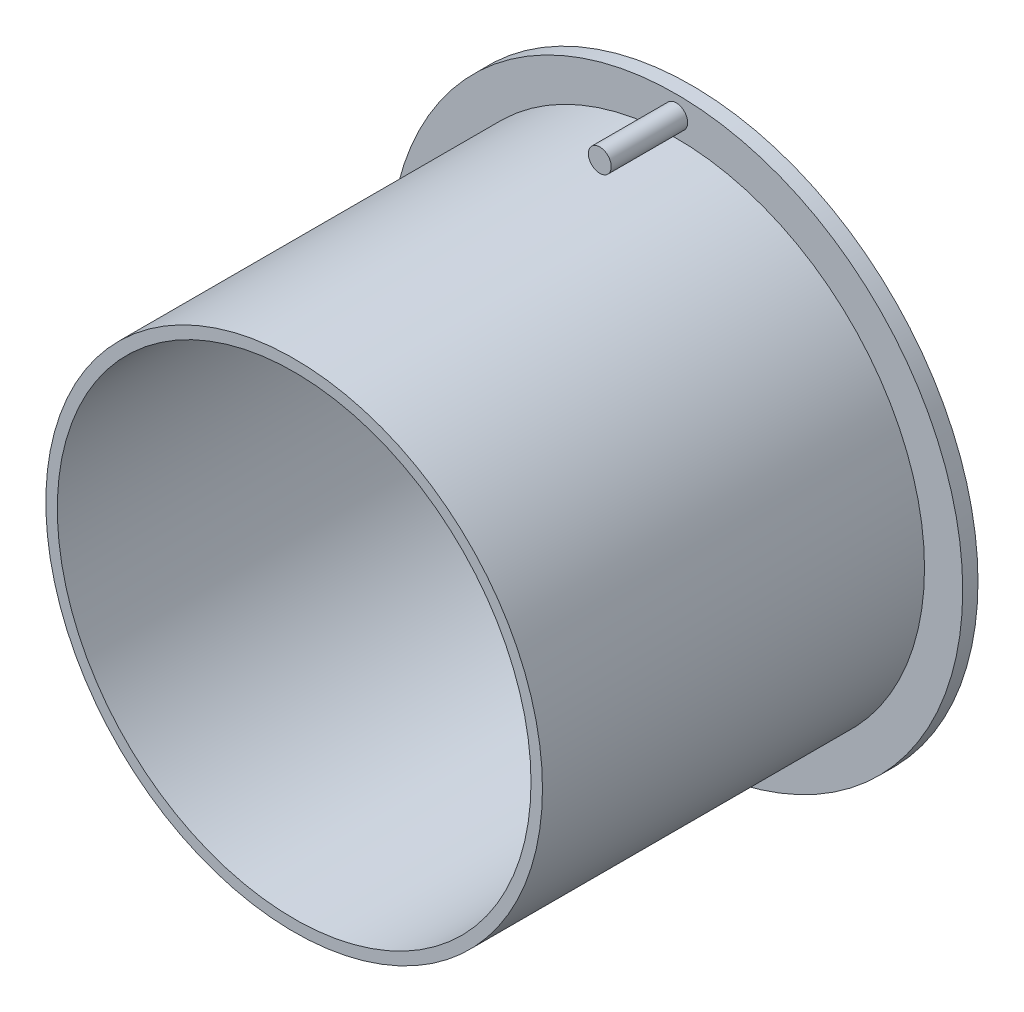
ISO-10303-21;
HEADER;
FILE_DESCRIPTION(('STEP AP214'),'2;1');
FILE_NAME('part.step','',(''),(''),'','','');
FILE_SCHEMA(('AUTOMOTIVE_DESIGN { 1 0 10303 214 1 1 1 1 }'));
ENDSEC;
DATA;
#1=APPLICATION_CONTEXT('core data for automotive mechanical design processes');
#2=APPLICATION_PROTOCOL_DEFINITION('international standard','automotive_design',2000,#1);
#3=PRODUCT_CONTEXT('',#1,'mechanical');
#4=PRODUCT('Part','Part','',(#3));
#5=PRODUCT_RELATED_PRODUCT_CATEGORY('part','',(#4));
#6=PRODUCT_DEFINITION_FORMATION('','',#4);
#7=PRODUCT_DEFINITION_CONTEXT('part definition',#1,'design');
#8=PRODUCT_DEFINITION('design','',#6,#7);
#9=PRODUCT_DEFINITION_SHAPE('','',#8);
#10=(LENGTH_UNIT() NAMED_UNIT(*) SI_UNIT(.MILLI.,.METRE.));
#11=(NAMED_UNIT(*) PLANE_ANGLE_UNIT() SI_UNIT($,.RADIAN.));
#12=(NAMED_UNIT(*) SI_UNIT($,.STERADIAN.) SOLID_ANGLE_UNIT());
#13=UNCERTAINTY_MEASURE_WITH_UNIT(LENGTH_MEASURE(1.E-05),#10,'distance_accuracy_value','');
#14=(GEOMETRIC_REPRESENTATION_CONTEXT(3) GLOBAL_UNCERTAINTY_ASSIGNED_CONTEXT((#13)) GLOBAL_UNIT_ASSIGNED_CONTEXT((#10,
#11,#12)) REPRESENTATION_CONTEXT('',''));
#15=CARTESIAN_POINT('',(0.,0.,0.));
#16=DIRECTION('',(0.,0.,1.));
#17=DIRECTION('',(1.,0.,0.));
#18=AXIS2_PLACEMENT_3D('',#15,#16,#17);
#19=CARTESIAN_POINT('',(0.,0.,55.));
#20=DIRECTION('',(0.,0.,-1.));
#21=DIRECTION('',(-1.,0.,0.));
#22=AXIS2_PLACEMENT_3D('',#19,#20,#21);
#23=CYLINDRICAL_SURFACE('',#22,32.5);
#24=CARTESIAN_POINT('',(0.,0.,0.));
#25=DIRECTION('',(0.,0.,1.));
#26=DIRECTION('',(1.,0.,0.));
#27=AXIS2_PLACEMENT_3D('',#24,#25,#26);
#28=CIRCLE('',#27,32.5);
#29=CARTESIAN_POINT('',(32.5,0.,0.));
#30=VERTEX_POINT('',#29);
#31=EDGE_CURVE('E58',#30,#30,#28,.T.);
#32=ORIENTED_EDGE('',*,*,#31,.T.);
#33=EDGE_LOOP('',(#32));
#34=FACE_BOUND('',#33,.T.);
#35=CARTESIAN_POINT('',(0.,0.,50.));
#36=DIRECTION('',(0.,0.,1.));
#37=DIRECTION('',(1.,0.,0.));
#38=AXIS2_PLACEMENT_3D('',#35,#36,#37);
#39=CIRCLE('',#38,32.5);
#40=CARTESIAN_POINT('',(32.5,0.,50.));
#41=VERTEX_POINT('',#40);
#42=EDGE_CURVE('E72',#41,#41,#39,.T.);
#43=ORIENTED_EDGE('',*,*,#42,.F.);
#44=EDGE_LOOP('',(#43));
#45=FACE_BOUND('',#44,.T.);
#46=ADVANCED_FACE('F42',(#34,#45),#23,.T.);
#47=CARTESIAN_POINT('',(0.,0.,-2.));
#48=DIRECTION('',(0.,0.,1.));
#49=DIRECTION('',(1.,0.,0.));
#50=AXIS2_PLACEMENT_3D('',#47,#48,#49);
#51=CYLINDRICAL_SURFACE('',#50,37.5);
#52=CARTESIAN_POINT('',(0.,0.,-2.));
#53=DIRECTION('',(0.,0.,1.));
#54=DIRECTION('',(1.,0.,0.));
#55=AXIS2_PLACEMENT_3D('',#52,#53,#54);
#56=CIRCLE('',#55,37.5);
#57=CARTESIAN_POINT('',(37.5,0.,-2.));
#58=VERTEX_POINT('',#57);
#59=EDGE_CURVE('E50',#58,#58,#56,.T.);
#60=ORIENTED_EDGE('',*,*,#59,.T.);
#61=EDGE_LOOP('',(#60));
#62=FACE_BOUND('',#61,.T.);
#63=CARTESIAN_POINT('',(0.,0.,0.));
#64=DIRECTION('',(0.,0.,1.));
#65=DIRECTION('',(1.,0.,0.));
#66=AXIS2_PLACEMENT_3D('',#63,#64,#65);
#67=CIRCLE('',#66,37.5);
#68=CARTESIAN_POINT('',(37.5,0.,0.));
#69=VERTEX_POINT('',#68);
#70=EDGE_CURVE('E54',#69,#69,#67,.T.);
#71=ORIENTED_EDGE('',*,*,#70,.F.);
#72=EDGE_LOOP('',(#71));
#73=FACE_BOUND('',#72,.T.);
#74=ADVANCED_FACE('F44',(#62,#73),#51,.T.);
#75=CARTESIAN_POINT('',(0.,0.,-2.));
#76=DIRECTION('',(0.,0.,1.));
#77=DIRECTION('',(1.,0.,0.));
#78=AXIS2_PLACEMENT_3D('',#75,#76,#77);
#79=PLANE('',#78);
#80=CARTESIAN_POINT('',(0.,16.96,-2.));
#81=DIRECTION('',(0.,0.,-1.));
#82=DIRECTION('',(-1.,0.,0.));
#83=AXIS2_PLACEMENT_3D('',#80,#81,#82);
#84=CIRCLE('',#83,12.5);
#85=CARTESIAN_POINT('',(-12.5,16.96,-2.));
#86=VERTEX_POINT('',#85);
#87=EDGE_CURVE('E80',#86,#86,#84,.T.);
#88=ORIENTED_EDGE('',*,*,#87,.F.);
#89=EDGE_LOOP('',(#88));
#90=FACE_BOUND('',#89,.T.);
#91=ORIENTED_EDGE('',*,*,#59,.F.);
#92=EDGE_LOOP('',(#91));
#93=FACE_BOUND('',#92,.T.);
#94=ADVANCED_FACE('F106',(#90,#93),#79,.F.);
#95=CARTESIAN_POINT('',(0.,0.,0.));
#96=DIRECTION('',(0.,0.,1.));
#97=DIRECTION('',(1.,0.,0.));
#98=AXIS2_PLACEMENT_3D('',#95,#96,#97);
#99=PLANE('',#98);
#100=CARTESIAN_POINT('',(0.,-35.,0.));
#101=DIRECTION('',(0.,0.,1.));
#102=DIRECTION('',(1.,0.,0.));
#103=AXIS2_PLACEMENT_3D('',#100,#101,#102);
#104=CIRCLE('',#103,1.5);
#105=CARTESIAN_POINT('',(1.5,-35.,0.));
#106=VERTEX_POINT('',#105);
#107=EDGE_CURVE('E66',#106,#106,#104,.T.);
#108=ORIENTED_EDGE('',*,*,#107,.F.);
#109=EDGE_LOOP('',(#108));
#110=FACE_BOUND('',#109,.T.);
#111=CARTESIAN_POINT('',(0.,35.,0.));
#112=DIRECTION('',(0.,0.,1.));
#113=DIRECTION('',(1.,0.,0.));
#114=AXIS2_PLACEMENT_3D('',#111,#112,#113);
#115=CIRCLE('',#114,1.5);
#116=CARTESIAN_POINT('',(1.5,35.,0.));
#117=VERTEX_POINT('',#116);
#118=EDGE_CURVE('E63',#117,#117,#115,.T.);
#119=ORIENTED_EDGE('',*,*,#118,.F.);
#120=EDGE_LOOP('',(#119));
#121=FACE_BOUND('',#120,.T.);
#122=ORIENTED_EDGE('',*,*,#31,.F.);
#123=EDGE_LOOP('',(#122));
#124=FACE_BOUND('',#123,.T.);
#125=ORIENTED_EDGE('',*,*,#70,.T.);
#126=EDGE_LOOP('',(#125));
#127=FACE_BOUND('',#126,.T.);
#128=ADVANCED_FACE('F94',(#110,#121,#124,#127),#99,.T.);
#129=CARTESIAN_POINT('',(0.,35.,10.));
#130=DIRECTION('',(0.,0.,-1.));
#131=DIRECTION('',(-1.,0.,0.));
#132=AXIS2_PLACEMENT_3D('',#129,#130,#131);
#133=CYLINDRICAL_SURFACE('',#132,1.5);
#134=CARTESIAN_POINT('',(0.,35.,10.));
#135=DIRECTION('',(0.,0.,1.));
#136=DIRECTION('',(1.,0.,0.));
#137=AXIS2_PLACEMENT_3D('',#134,#135,#136);
#138=CIRCLE('',#137,1.5);
#139=CARTESIAN_POINT('',(1.5,35.,10.));
#140=VERTEX_POINT('',#139);
#141=EDGE_CURVE('E62',#140,#140,#138,.T.);
#142=ORIENTED_EDGE('',*,*,#141,.F.);
#143=EDGE_LOOP('',(#142));
#144=FACE_BOUND('',#143,.T.);
#145=ORIENTED_EDGE('',*,*,#118,.T.);
#146=EDGE_LOOP('',(#145));
#147=FACE_BOUND('',#146,.T.);
#148=ADVANCED_FACE('F105',(#144,#147),#133,.T.);
#149=CARTESIAN_POINT('',(0.,35.,10.));
#150=DIRECTION('',(0.,0.,1.));
#151=DIRECTION('',(1.,0.,0.));
#152=AXIS2_PLACEMENT_3D('',#149,#150,#151);
#153=PLANE('',#152);
#154=ORIENTED_EDGE('',*,*,#141,.T.);
#155=EDGE_LOOP('',(#154));
#156=FACE_BOUND('',#155,.T.);
#157=ADVANCED_FACE('F139',(#156),#153,.T.);
#158=CARTESIAN_POINT('',(0.,-35.,10.));
#159=DIRECTION('',(0.,0.,-1.));
#160=DIRECTION('',(-1.,0.,0.));
#161=AXIS2_PLACEMENT_3D('',#158,#159,#160);
#162=CYLINDRICAL_SURFACE('',#161,1.5);
#163=CARTESIAN_POINT('',(0.,-35.,10.));
#164=DIRECTION('',(0.,0.,1.));
#165=DIRECTION('',(1.,0.,0.));
#166=AXIS2_PLACEMENT_3D('',#163,#164,#165);
#167=CIRCLE('',#166,1.5);
#168=CARTESIAN_POINT('',(1.5,-35.,10.));
#169=VERTEX_POINT('',#168);
#170=EDGE_CURVE('E69',#169,#169,#167,.T.);
#171=ORIENTED_EDGE('',*,*,#170,.F.);
#172=EDGE_LOOP('',(#171));
#173=FACE_BOUND('',#172,.T.);
#174=ORIENTED_EDGE('',*,*,#107,.T.);
#175=EDGE_LOOP('',(#174));
#176=FACE_BOUND('',#175,.T.);
#177=ADVANCED_FACE('F146',(#173,#176),#162,.T.);
#178=CARTESIAN_POINT('',(0.,-35.,10.));
#179=DIRECTION('',(0.,0.,1.));
#180=DIRECTION('',(1.,0.,0.));
#181=AXIS2_PLACEMENT_3D('',#178,#179,#180);
#182=PLANE('',#181);
#183=ORIENTED_EDGE('',*,*,#170,.T.);
#184=EDGE_LOOP('',(#183));
#185=FACE_BOUND('',#184,.T.);
#186=ADVANCED_FACE('F100',(#185),#182,.T.);
#187=CARTESIAN_POINT('',(0.,0.,50.));
#188=DIRECTION('',(0.,0.,1.));
#189=DIRECTION('',(1.,0.,0.));
#190=AXIS2_PLACEMENT_3D('',#187,#188,#189);
#191=PLANE('',#190);
#192=CARTESIAN_POINT('',(0.,0.,50.));
#193=DIRECTION('',(0.,0.,1.));
#194=DIRECTION('',(1.,0.,0.));
#195=AXIS2_PLACEMENT_3D('',#192,#193,#194);
#196=CIRCLE('',#195,31.);
#197=CARTESIAN_POINT('',(31.,0.,50.));
#198=VERTEX_POINT('',#197);
#199=EDGE_CURVE('E77',#198,#198,#196,.T.);
#200=ORIENTED_EDGE('',*,*,#199,.F.);
#201=EDGE_LOOP('',(#200));
#202=FACE_BOUND('',#201,.T.);
#203=ORIENTED_EDGE('',*,*,#42,.T.);
#204=EDGE_LOOP('',(#203));
#205=FACE_BOUND('',#204,.T.);
#206=ADVANCED_FACE('F93',(#202,#205),#191,.T.);
#207=CARTESIAN_POINT('',(0.,16.96,0.));
#208=DIRECTION('',(0.,0.,1.));
#209=DIRECTION('',(1.,0.,0.));
#210=AXIS2_PLACEMENT_3D('',#207,#208,#209);
#211=CIRCLE('',#210,12.5);
#212=CARTESIAN_POINT('',(12.5,16.96,0.));
#213=VERTEX_POINT('',#212);
#214=EDGE_CURVE('E46',#213,#213,#211,.T.);
#215=ORIENTED_EDGE('',*,*,#214,.F.);
#216=EDGE_LOOP('',(#215));
#217=FACE_BOUND('',#216,.T.);
#218=CARTESIAN_POINT('',(0.,0.,0.));
#219=DIRECTION('',(0.,0.,1.));
#220=DIRECTION('',(1.,0.,0.));
#221=AXIS2_PLACEMENT_3D('',#218,#219,#220);
#222=CIRCLE('',#221,31.);
#223=CARTESIAN_POINT('',(31.,0.,0.));
#224=VERTEX_POINT('',#223);
#225=EDGE_CURVE('E10',#224,#224,#222,.F.);
#226=ORIENTED_EDGE('',*,*,#225,.F.);
#227=EDGE_LOOP('',(#226));
#228=FACE_BOUND('',#227,.T.);
#229=ADVANCED_FACE('F89',(#217,#228),#99,.T.);
#230=CARTESIAN_POINT('',(0.,0.,55.));
#231=DIRECTION('',(0.,0.,-1.));
#232=DIRECTION('',(-1.,0.,0.));
#233=AXIS2_PLACEMENT_3D('',#230,#231,#232);
#234=CYLINDRICAL_SURFACE('',#233,31.);
#235=ORIENTED_EDGE('',*,*,#225,.T.);
#236=EDGE_LOOP('',(#235));
#237=FACE_BOUND('',#236,.T.);
#238=ORIENTED_EDGE('',*,*,#199,.T.);
#239=EDGE_LOOP('',(#238));
#240=FACE_BOUND('',#239,.T.);
#241=ADVANCED_FACE('F92',(#237,#240),#234,.F.);
#242=CARTESIAN_POINT('',(0.,16.96,98.));
#243=DIRECTION('',(0.,0.,-1.));
#244=DIRECTION('',(-1.,0.,0.));
#245=AXIS2_PLACEMENT_3D('',#242,#243,#244);
#246=CYLINDRICAL_SURFACE('',#245,12.5);
#247=ORIENTED_EDGE('',*,*,#214,.T.);
#248=EDGE_LOOP('',(#247));
#249=FACE_BOUND('',#248,.T.);
#250=ORIENTED_EDGE('',*,*,#87,.T.);
#251=EDGE_LOOP('',(#250));
#252=FACE_BOUND('',#251,.T.);
#253=ADVANCED_FACE('F87',(#249,#252),#246,.F.);
#254=CLOSED_SHELL('',(#46,#74,#94,#128,#148,#157,#177,#186,#206,#229,#241,#253));
#255=MANIFOLD_SOLID_BREP('B2',#254);
#256=ADVANCED_BREP_SHAPE_REPRESENTATION('',(#18,#255),#14);
#257=SHAPE_DEFINITION_REPRESENTATION(#9,#256);
ENDSEC;
END-ISO-10303-21;
